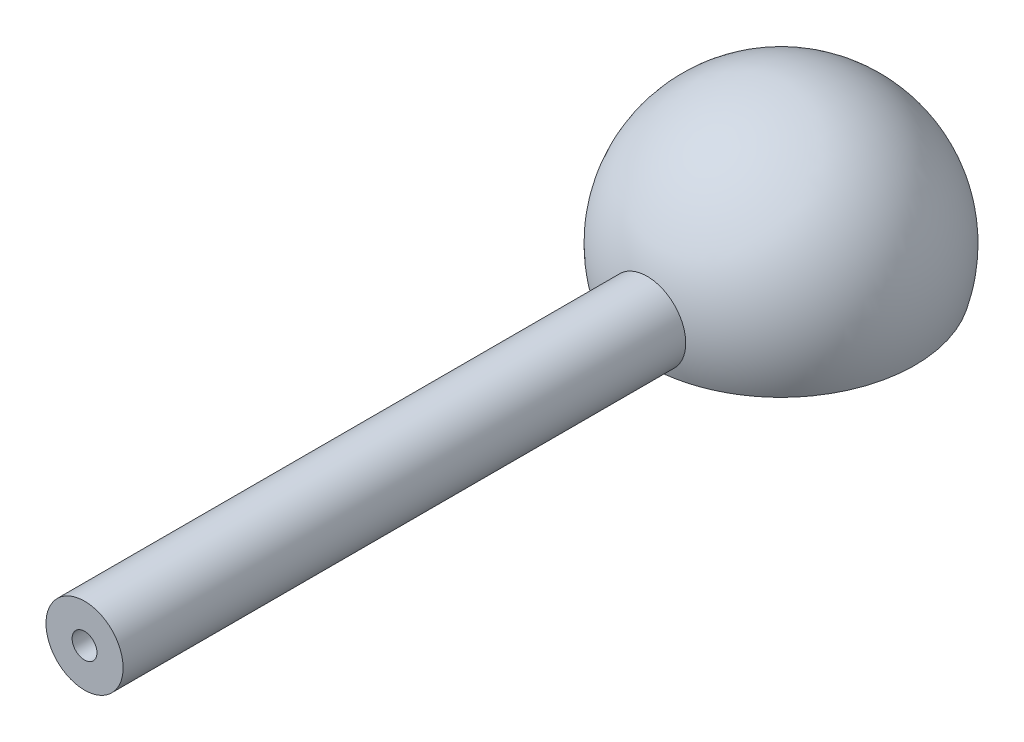
ISO-10303-21;
HEADER;
FILE_DESCRIPTION(('STEP AP214'),'2;1');
FILE_NAME('part.step','',(''),(''),'','','');
FILE_SCHEMA(('AUTOMOTIVE_DESIGN { 1 0 10303 214 1 1 1 1 }'));
ENDSEC;
DATA;
#1=APPLICATION_CONTEXT('core data for automotive mechanical design processes');
#2=APPLICATION_PROTOCOL_DEFINITION('international standard','automotive_design',2000,#1);
#3=PRODUCT_CONTEXT('',#1,'mechanical');
#4=PRODUCT('Part','Part','',(#3));
#5=PRODUCT_RELATED_PRODUCT_CATEGORY('part','',(#4));
#6=PRODUCT_DEFINITION_FORMATION('','',#4);
#7=PRODUCT_DEFINITION_CONTEXT('part definition',#1,'design');
#8=PRODUCT_DEFINITION('design','',#6,#7);
#9=PRODUCT_DEFINITION_SHAPE('','',#8);
#10=(LENGTH_UNIT() NAMED_UNIT(*) SI_UNIT(.MILLI.,.METRE.));
#11=(NAMED_UNIT(*) PLANE_ANGLE_UNIT() SI_UNIT($,.RADIAN.));
#12=(NAMED_UNIT(*) SI_UNIT($,.STERADIAN.) SOLID_ANGLE_UNIT());
#13=UNCERTAINTY_MEASURE_WITH_UNIT(LENGTH_MEASURE(1.E-05),#10,'distance_accuracy_value','');
#14=(GEOMETRIC_REPRESENTATION_CONTEXT(3) GLOBAL_UNCERTAINTY_ASSIGNED_CONTEXT((#13)) GLOBAL_UNIT_ASSIGNED_CONTEXT((#10,
#11,#12)) REPRESENTATION_CONTEXT('',''));
#15=CARTESIAN_POINT('',(0.,0.,0.));
#16=DIRECTION('',(0.,0.,1.));
#17=DIRECTION('',(1.,0.,0.));
#18=AXIS2_PLACEMENT_3D('',#15,#16,#17);
#19=CARTESIAN_POINT('',(0.,0.,130.));
#20=DIRECTION('',(0.,0.,-1.));
#21=DIRECTION('',(-1.,0.,0.));
#22=AXIS2_PLACEMENT_3D('',#19,#20,#21);
#23=CYLINDRICAL_SURFACE('',#22,9.);
#24=CARTESIAN_POINT('',(0.,0.,-1.27100706074562));
#25=DIRECTION('',(0.,0.,-1.));
#26=DIRECTION('',(-1.,0.,0.));
#27=AXIS2_PLACEMENT_3D('',#24,#25,#26);
#28=CIRCLE('',#27,8.99999999999998);
#29=CARTESIAN_POINT('',(0.,-9.,-1.27100706074562));
#30=VERTEX_POINT('',#29);
#31=EDGE_CURVE('E91',#30,#30,#28,.T.);
#32=ORIENTED_EDGE('',*,*,#31,.F.);
#33=EDGE_LOOP('',(#32));
#34=FACE_BOUND('',#33,.T.);
#35=CARTESIAN_POINT('',(0.,0.,130.));
#36=DIRECTION('',(0.,0.,1.));
#37=DIRECTION('',(1.,0.,0.));
#38=AXIS2_PLACEMENT_3D('',#35,#36,#37);
#39=CIRCLE('',#38,9.);
#40=CARTESIAN_POINT('',(9.,0.,130.));
#41=VERTEX_POINT('',#40);
#42=EDGE_CURVE('E11',#41,#41,#39,.T.);
#43=ORIENTED_EDGE('',*,*,#42,.F.);
#44=EDGE_LOOP('',(#43));
#45=FACE_BOUND('',#44,.T.);
#46=ADVANCED_FACE('F44',(#34,#45),#23,.T.);
#47=CARTESIAN_POINT('',(0.,0.,130.));
#48=DIRECTION('',(0.,0.,1.));
#49=DIRECTION('',(1.,0.,0.));
#50=AXIS2_PLACEMENT_3D('',#47,#48,#49);
#51=PLANE('',#50);
#52=CARTESIAN_POINT('',(0.,0.,130.));
#53=DIRECTION('',(0.,0.,1.));
#54=DIRECTION('',(1.,0.,0.));
#55=AXIS2_PLACEMENT_3D('',#52,#53,#54);
#56=CIRCLE('',#55,2.9);
#57=CARTESIAN_POINT('',(2.9,0.,130.));
#58=VERTEX_POINT('',#57);
#59=EDGE_CURVE('E95',#58,#58,#56,.T.);
#60=ORIENTED_EDGE('',*,*,#59,.F.);
#61=EDGE_LOOP('',(#60));
#62=FACE_BOUND('',#61,.T.);
#63=ORIENTED_EDGE('',*,*,#42,.T.);
#64=EDGE_LOOP('',(#63));
#65=FACE_BOUND('',#64,.T.);
#66=ADVANCED_FACE('F82',(#62,#65),#51,.T.);
#67=CARTESIAN_POINT('',(0.,0.,20.));
#68=DIRECTION('',(0.,0.,1.));
#69=DIRECTION('',(1.,0.,0.));
#70=AXIS2_PLACEMENT_3D('',#67,#68,#69);
#71=CYLINDRICAL_SURFACE('',#70,2.9);
#72=CARTESIAN_POINT('',(0.,0.,20.));
#73=DIRECTION('',(0.,0.,1.));
#74=DIRECTION('',(1.,0.,0.));
#75=AXIS2_PLACEMENT_3D('',#72,#73,#74);
#76=CIRCLE('',#75,2.9);
#77=CARTESIAN_POINT('',(2.9,0.,20.));
#78=VERTEX_POINT('',#77);
#79=EDGE_CURVE('E53',#78,#78,#76,.T.);
#80=ORIENTED_EDGE('',*,*,#79,.F.);
#81=EDGE_LOOP('',(#80));
#82=FACE_BOUND('',#81,.T.);
#83=ORIENTED_EDGE('',*,*,#59,.T.);
#84=EDGE_LOOP('',(#83));
#85=FACE_BOUND('',#84,.T.);
#86=ADVANCED_FACE('F75',(#82,#85),#71,.F.);
#87=CARTESIAN_POINT('',(0.,0.,20.));
#88=DIRECTION('',(0.,0.,1.));
#89=DIRECTION('',(1.,0.,0.));
#90=AXIS2_PLACEMENT_3D('',#87,#88,#89);
#91=PLANE('',#90);
#92=ORIENTED_EDGE('',*,*,#79,.T.);
#93=EDGE_LOOP('',(#92));
#94=FACE_BOUND('',#93,.T.);
#95=ADVANCED_FACE('F65',(#94),#91,.T.);
#96=CARTESIAN_POINT('',(0.,0.,-32.5));
#97=DIRECTION('',(0.,1.,0.));
#98=DIRECTION('',(1.,0.,0.));
#99=AXIS2_PLACEMENT_3D('',#96,#97,#98);
#100=ELLIPSE('',#99,32.5,32.5);
#101=TRIMMED_CURVE('',#100,(PARAMETER_VALUE(1.5707963267949)),
(PARAMETER_VALUE(4.71238898038469)),.T.,.PARAMETER.);
#102=CARTESIAN_POINT('',(0.,0.,-65.));
#103=DIRECTION('',(0.,0.,-1.));
#104=AXIS1_PLACEMENT('',#102,#103);
#105=SURFACE_OF_REVOLUTION('',#101,#104);
#106=ORIENTED_EDGE('',*,*,#31,.T.);
#107=CARTESIAN_POINT('',(0.,-9.00000000000001,-1.27100706074561));
#108=CARTESIAN_POINT('',(-1.09121169100416,-9.00000000000001,-1.27101462029589));
#109=CARTESIAN_POINT('',(-2.18257813141674,-9.,-1.32825904998093));
#110=CARTESIAN_POINT('',(-4.3533184452436,-9.,-1.5566698646595));
#111=CARTESIAN_POINT('',(-5.43269238798555,-9.,-1.72783559073434));
#112=CARTESIAN_POINT('',(-7.35816859991174,-9.,-2.13756367035628));
#113=CARTESIAN_POINT('',(-8.2085363619717,-9.,-2.35634749586137));
#114=CARTESIAN_POINT('',(-9.8881124381179,-9.,-2.86479920158872));
#115=CARTESIAN_POINT('',(-10.7173150880257,-9.,-3.15448584157706));
#116=CARTESIAN_POINT('',(-12.3492805331064,-9.,-3.80301104589659));
#117=CARTESIAN_POINT('',(-13.1520127658921,-9.,-4.16192647812892));
#118=CARTESIAN_POINT('',(-14.7243159955969,-9.,-4.94612155391398));
#119=CARTESIAN_POINT('',(-15.4938892060885,-9.00000000000001,-5.37139675875008));
#120=CARTESIAN_POINT('',(-16.9941065072693,-9.00000000000001,-6.28509253299466));
#121=CARTESIAN_POINT('',(-17.7247682027288,-9.,-6.77348419789206));
#122=CARTESIAN_POINT('',(-19.142357309746,-9.,-7.81009926493778));
#123=CARTESIAN_POINT('',(-19.829284025757,-9.,-8.3583236182692));
#124=CARTESIAN_POINT('',(-21.1543346851692,-9.,-9.51055081265856));
#125=CARTESIAN_POINT('',(-21.7924711204248,-9.,-10.1145392883218));
#126=CARTESIAN_POINT('',(-23.0155987108718,-9.,-11.374118765068));
#127=CARTESIAN_POINT('',(-23.6005900754352,-9.,-12.0297095628378));
#128=CARTESIAN_POINT('',(-24.7133320437638,-9.,-13.3879088833848));
#129=CARTESIAN_POINT('',(-25.2410765092781,-9.,-14.0905224351029));
#130=CARTESIAN_POINT('',(-26.2355014563035,-9.,-15.5377102786163));
#131=CARTESIAN_POINT('',(-26.7021818754775,-9.,-16.282284613246));
#132=CARTESIAN_POINT('',(-27.5711774932994,-9.,-17.808130096285));
#133=CARTESIAN_POINT('',(-27.9734901651407,-9.,-18.5894026837564));
#134=CARTESIAN_POINT('',(-28.7108677650759,-9.,-20.1830628144949));
#135=CARTESIAN_POINT('',(-29.0459327064345,-9.00000000000001,-20.9954503516247));
#136=CARTESIAN_POINT('',(-29.6464271217268,-9.00000000000001,-22.6455492550538));
#137=CARTESIAN_POINT('',(-29.9118578991476,-9.,-23.4832601469962));
#138=CARTESIAN_POINT('',(-30.3712051681035,-9.,-25.1780646548374));
#139=CARTESIAN_POINT('',(-30.5651216583103,-9.,-26.0351582710962));
#140=CARTESIAN_POINT('',(-30.8800613888084,-9.,-27.7626330044566));
#141=CARTESIAN_POINT('',(-31.0010847782125,-9.00000000000001,-28.6330140943731));
#142=CARTESIAN_POINT('',(-31.1693785264939,-9.,-30.3808776139644));
#143=CARTESIAN_POINT('',(-31.2166488854577,-8.99999999999999,-31.2583600436308));
#144=CARTESIAN_POINT('',(-31.2371005291583,-8.99999999999999,-33.0141895756849));
#145=CARTESIAN_POINT('',(-31.2102816710662,-9.,-33.8925366797362));
#146=CARTESIAN_POINT('',(-31.0827452413462,-9.00000000000001,-35.6438493367776));
#147=CARTESIAN_POINT('',(-30.982027669739,-9.,-36.5168148897691));
#148=CARTESIAN_POINT('',(-30.7074101058874,-9.,-38.2511565949928));
#149=CARTESIAN_POINT('',(-30.5335102465747,-9.,-39.1125327682735));
#150=CARTESIAN_POINT('',(-30.1137644454871,-9.,-40.8175734747158));
#151=CARTESIAN_POINT('',(-29.8679185038001,-9.00000000000001,-41.6612380078991));
#152=CARTESIAN_POINT('',(-29.3060282462703,-9.00000000000001,-43.3248578094392));
#153=CARTESIAN_POINT('',(-28.9899839040377,-9.,-44.1448130688827));
#154=CARTESIAN_POINT('',(-28.2899437815519,-9.,-45.7551846085263));
#155=CARTESIAN_POINT('',(-27.9059480012081,-9.,-46.545600888687));
#156=CARTESIAN_POINT('',(-27.0727345357553,-9.,-48.0912759120119));
#157=CARTESIAN_POINT('',(-26.6235167812314,-9.,-48.8465346177572));
#158=CARTESIAN_POINT('',(-25.6630533446053,-9.,-50.3165241515818));
#159=CARTESIAN_POINT('',(-25.1518076624712,-9.00000000000001,-51.0312549796403));
#160=CARTESIAN_POINT('',(-24.0709232027363,-9.00000000000001,-52.4151072172093));
#161=CARTESIAN_POINT('',(-23.501284444302,-9.,-53.0842286416902));
#162=CARTESIAN_POINT('',(-22.3076634850059,-9.,-54.3721052745974));
#163=CARTESIAN_POINT('',(-21.6836812841842,-9.,-54.990860483061));
#164=CARTESIAN_POINT('',(-20.3858098464218,-9.,-56.1736054622076));
#165=CARTESIAN_POINT('',(-19.7119206298492,-9.,-56.7375952552411));
#166=CARTESIAN_POINT('',(-18.3190258828803,-9.,-57.8068000619616));
#167=CARTESIAN_POINT('',(-17.6000203524893,-9.,-58.3120150756554));
#168=CARTESIAN_POINT('',(-16.1220045720644,-9.,-59.2600786147026));
#169=CARTESIAN_POINT('',(-15.3629943165014,-9.,-59.7029271314361));
#170=CARTESIAN_POINT('',(-13.8103652841963,-9.,-60.5231092065968));
#171=CARTESIAN_POINT('',(-13.0167465074455,-9.,-60.9004427650076));
#172=CARTESIAN_POINT('',(-11.4005424795197,-9.,-61.5869123535489));
#173=CARTESIAN_POINT('',(-10.5779572245259,-9.,-61.8960483746887));
#174=CARTESIAN_POINT('',(-8.90966842818976,-9.,-62.4439250531867));
#175=CARTESIAN_POINT('',(-8.06396488684652,-9.00000000000001,-62.6826657105424));
#176=CARTESIAN_POINT('',(-6.35545200095075,-9.00000000000001,-63.0880543494989));
#177=CARTESIAN_POINT('',(-5.4926426571354,-9.,-63.2547023342064));
#178=CARTESIAN_POINT('',(-3.75605218873982,-9.,-63.5147208754143));
#179=CARTESIAN_POINT('',(-2.88227106416046,-9.,-63.6080914319204));
#180=CARTESIAN_POINT('',(-1.12994913482816,-9.,-63.7208913054453));
#181=CARTESIAN_POINT('',(-0.251408330292715,-9.,-63.7403206258427));
#182=CARTESIAN_POINT('',(1.50418710011557,-9.,-63.7050999056521));
#183=CARTESIAN_POINT('',(2.38124172598846,-9.00000000000001,-63.6504498650661));
#184=CARTESIAN_POINT('',(4.12762946615012,-9.00000000000001,-63.4674589519904));
#185=CARTESIAN_POINT('',(4.99696258044166,-9.,-63.3391180795268));
#186=CARTESIAN_POINT('',(6.72172686046704,-9.,-63.0096579293626));
#187=CARTESIAN_POINT('',(7.57715802620049,-9.,-62.8085386516599));
#188=CARTESIAN_POINT('',(9.26803684559245,-9.,-62.3349515175289));
#189=CARTESIAN_POINT('',(10.1034844983236,-9.,-62.0624836577896));
#190=CARTESIAN_POINT('',(11.7484567180875,-9.,-61.4481364472466));
#191=CARTESIAN_POINT('',(12.5579812851181,-9.,-61.1062570964372));
#192=CARTESIAN_POINT('',(14.1453521337152,-9.,-60.3555174445974));
#193=CARTESIAN_POINT('',(14.923198413878,-9.,-59.9466571405991));
#194=CARTESIAN_POINT('',(16.44168262895,-9.,-59.0648623452531));
#195=CARTESIAN_POINT('',(17.1823205638605,-9.,-58.5919278539077));
#196=CARTESIAN_POINT('',(18.6211224985784,-9.,-57.5853470332402));
#197=CARTESIAN_POINT('',(19.3192865041185,-9.,-57.0517007121127));
#198=CARTESIAN_POINT('',(20.6681771615171,-9.,-55.9274900854697));
#199=CARTESIAN_POINT('',(21.3189038133879,-9.,-55.3369257799691));
#200=CARTESIAN_POINT('',(22.5682933993967,-9.,-54.103077829461));
#201=CARTESIAN_POINT('',(23.1669563408816,-9.,-53.4597941918931));
#202=CARTESIAN_POINT('',(24.3079624760348,-9.,-52.1250808643214));
#203=CARTESIAN_POINT('',(24.8503056696963,-9.,-51.4336511743117));
#204=CARTESIAN_POINT('',(25.874816789428,-9.,-50.0075610929392));
#205=CARTESIAN_POINT('',(26.356984690402,-9.,-49.272900683547));
#206=CARTESIAN_POINT('',(27.2577170345953,-9.,-47.7655724220946));
#207=CARTESIAN_POINT('',(27.676281477767,-9.,-46.992904570006));
#208=CARTESIAN_POINT('',(28.4468312907642,-9.,-45.4150543684254));
#209=CARTESIAN_POINT('',(28.7988166384216,-9.,-44.6098720081075));
#210=CARTESIAN_POINT('',(29.4337056797823,-9.,-42.9727174019057));
#211=CARTESIAN_POINT('',(29.7166093735219,-9.,-42.1407451560358));
#212=CARTESIAN_POINT('',(30.21132356138,-9.,-40.4559265221511));
#213=CARTESIAN_POINT('',(30.42313413247,-9.,-39.6030801567374));
#214=CARTESIAN_POINT('',(30.7741566523536,-9.,-37.8825756369759));
#215=CARTESIAN_POINT('',(30.9133686012451,-9.,-37.0149174826479));
#216=CARTESIAN_POINT('',(31.118204126752,-9.,-35.270958229386));
#217=CARTESIAN_POINT('',(31.1838277305354,-9.,-34.3946571336431));
#218=CARTESIAN_POINT('',(31.2410201145267,-9.,-32.639641645347));
#219=CARTESIAN_POINT('',(31.2325888946434,-9.,-31.760927252791));
#220=CARTESIAN_POINT('',(31.1417314888779,-9.,-30.0073306947185));
#221=CARTESIAN_POINT('',(31.059305168228,-9.,-29.1324485361847));
#222=CARTESIAN_POINT('',(30.8210433766428,-9.,-27.3927379575103));
#223=CARTESIAN_POINT('',(30.665207905678,-9.00000000000001,-26.5279095373737));
#224=CARTESIAN_POINT('',(30.2812361046889,-9.00000000000001,-24.8144566085794));
#225=CARTESIAN_POINT('',(30.0530999221978,-9.,-23.9658320668605));
#226=CARTESIAN_POINT('',(29.5261485096089,-9.,-22.2908182777976));
#227=CARTESIAN_POINT('',(29.2273332795151,-9.,-21.4644290304523));
#228=CARTESIAN_POINT('',(28.5611474079179,-9.,-19.8397591067272));
#229=CARTESIAN_POINT('',(28.193776611157,-9.,-19.0414784940098));
#230=CARTESIAN_POINT('',(27.3930918507298,-9.,-17.4787031322321));
#231=CARTESIAN_POINT('',(26.9597778878663,-9.00000000000001,-16.7142083827606));
#232=CARTESIAN_POINT('',(26.030278358642,-9.00000000000001,-15.224425357023));
#233=CARTESIAN_POINT('',(25.534091570583,-9.,-14.4991378429936));
#234=CARTESIAN_POINT('',(24.4823806242607,-9.,-13.0929417499085));
#235=CARTESIAN_POINT('',(23.9268564557823,-9.,-12.4120331784927));
#236=CARTESIAN_POINT('',(22.7604443240045,-9.,-11.0994630415563));
#237=CARTESIAN_POINT('',(22.1495586267526,-9.,-10.467799462316));
#238=CARTESIAN_POINT('',(20.8767475053885,-9.,-9.25817950326863));
#239=CARTESIAN_POINT('',(20.2148221281326,-9.,-8.68022307415753));
#240=CARTESIAN_POINT('',(18.8447124999005,-9.,-7.58218614982155));
#241=CARTESIAN_POINT('',(18.1365333602952,-9.,-7.06209927671293));
#242=CARTESIAN_POINT('',(16.6788817721266,-9.,-6.08342291125685));
#243=CARTESIAN_POINT('',(15.9294091789835,-9.,-5.62483363424864));
#244=CARTESIAN_POINT('',(14.3942961586391,-9.,-4.7723011053097));
#245=CARTESIAN_POINT('',(13.6086462104194,-9.,-4.37837499714187));
#246=CARTESIAN_POINT('',(12.0069624196472,-9.,-3.65812270083005));
#247=CARTESIAN_POINT('',(11.1909290070078,-9.,-3.33179555661792));
#248=CARTESIAN_POINT('',(9.53175747879597,-9.,-2.74817158691787));
#249=CARTESIAN_POINT('',(8.68854476065241,-9.,-2.49108681431057));
#250=CARTESIAN_POINT('',(6.9833551633399,-9.,-2.04907897503269));
#251=CARTESIAN_POINT('',(6.12137698637557,-9.,-1.86416091616618));
#252=CARTESIAN_POINT('',(4.38583227802104,-9.,-1.56800206970643));
#253=CARTESIAN_POINT('',(3.51227976033253,-9.,-1.45667924769263));
#254=CARTESIAN_POINT('',(1.75918390312392,-9.,-1.30818862577003));
#255=CARTESIAN_POINT('',(0.879642231313656,-9.00000000000001,-1.27100096687792));
#256=CARTESIAN_POINT('',(0.,-9.00000000000001,-1.27100706074561));
#257=B_SPLINE_CURVE_WITH_KNOTS('',3,(#107,#108,#109,#110,#111,#112,#113,#114,#115,#116,#117,
#118,#119,#120,#121,#122,#123,#124,#125,#126,#127,#128,#129,#130,#131,#132,#133,#134,#135,#136,
#137,#138,#139,#140,#141,#142,#143,#144,#145,#146,#147,#148,#149,#150,#151,#152,#153,#154,#155,
#156,#157,#158,#159,#160,#161,#162,#163,#164,#165,#166,#167,#168,#169,#170,#171,#172,#173,#174,
#175,#176,#177,#178,#179,#180,#181,#182,#183,#184,#185,#186,#187,#188,#189,#190,#191,#192,#193,
#194,#195,#196,#197,#198,#199,#200,#201,#202,#203,#204,#205,#206,#207,#208,#209,#210,#211,#212,
#213,#214,#215,#216,#217,#218,#219,#220,#221,#222,#223,#224,#225,#226,#227,#228,#229,#230,#231,
#232,#233,#234,#235,#236,#237,#238,#239,#240,#241,#242,#243,#244,#245,#246,#247,#248,#249,#250,
#251,#252,#253,#254,#255,#256),.UNSPECIFIED.,.T.,.F.,(4,2,2,2,2,2,2,2,2,2,2,2,2,2,2,2,2,2,2,2,2,
2,2,2,2,2,2,2,2,2,2,2,2,2,2,2,2,2,2,2,2,2,2,2,2,2,2,2,2,2,2,2,2,2,2,2,2,2,2,2,2,2,2,2,2,2,2,2,2,
2,2,2,2,2,4),(0.,3.27244622302445,6.54487351844482,9.17606842309235,11.807960254399,
14.4427913956208,17.0774463719923,19.7108990418891,22.3443935828888,24.9772115923063,
27.6100192289397,30.2431088877109,32.8762012344424,35.5093969199353,38.1425920860313,
40.7757379576384,43.4088838781485,46.0420244121803,48.6751649431265,51.3083105502327,
53.9414561566003,56.5745969800221,59.2077378002217,61.8408796103022,64.4740214238929,
67.1071660399249,69.7403106573169,72.3734544104382,75.0065981616197,77.6397408381703,
80.2728835144121,82.9060265545949,85.5391695954429,88.1723129834284,90.8054563715074,
93.4385996461113,96.0717429205078,98.7048860745916,101.338029228603,103.971172381674,
106.604315534817,109.237458810151,111.870602085698,114.503745477916,117.136888870039,
119.770031906756,122.403174942793,125.036317607257,127.669460272041,130.302604034978,
132.935747799888,135.568892441526,138.202037081779,140.835178871158,143.468320656983,
146.10146147068,148.73460228762,151.36774790032,154.000893514079,156.634033754806,
159.267173995388,161.900320199308,164.533466371174,167.166663716234,169.799861514602,
172.432951580054,175.066039228265,177.698836392207,180.331642774879,182.965146054443,
185.598612085203,188.240053625288,190.881678428127,193.520353703242,196.158322047245),.UNSPECIFIED.);
#258=EDGE_CURVE('E59',#30,#30,#257,.T.);
#259=ORIENTED_EDGE('',*,*,#258,.F.);
#260=EDGE_LOOP('',(#106,#259));
#261=FACE_BOUND('',#260,.T.);
#262=CARTESIAN_POINT('',(0.,0.,-65.));
#263=VERTEX_POINT('',#262);
#264=VERTEX_LOOP('',#263);
#265=FACE_BOUND('',#264,.T.);
#266=ADVANCED_FACE('F62',(#261,#265),#105,.F.);
#267=CARTESIAN_POINT('',(50.,-9.,0.235218720654392));
#268=DIRECTION('',(0.,1.,0.));
#269=DIRECTION('',(0.,0.,1.));
#270=AXIS2_PLACEMENT_3D('',#267,#268,#269);
#271=PLANE('',#270);
#272=ORIENTED_EDGE('',*,*,#258,.T.);
#273=EDGE_LOOP('',(#272));
#274=FACE_BOUND('',#273,.T.);
#275=CARTESIAN_POINT('',(0.,-9.,-32.6201692239184));
#276=DIRECTION('',(0.,1.,0.));
#277=DIRECTION('',(0.,0.,1.));
#278=AXIS2_PLACEMENT_3D('',#275,#276,#277);
#279=CIRCLE('',#278,30.);
#280=CARTESIAN_POINT('',(0.,-9.,-2.62016922391838));
#281=VERTEX_POINT('',#280);
#282=EDGE_CURVE('E47',#281,#281,#279,.F.);
#283=ORIENTED_EDGE('',*,*,#282,.F.);
#284=EDGE_LOOP('',(#283));
#285=FACE_BOUND('',#284,.T.);
#286=ADVANCED_FACE('F64',(#274,#285),#271,.F.);
#287=CARTESIAN_POINT('',(0.378974550513894,0.,-32.7609216958857));
#288=DIRECTION('',(0.,0.,-1.));
#289=DIRECTION('',(1.,0.,0.));
#290=AXIS2_PLACEMENT_3D('',#287,#288,#289);
#291=SPHERICAL_SURFACE('',#290,27.5);
#292=CARTESIAN_POINT('',(0.378974550513894,0.,-32.7609216958857));
#293=DIRECTION('',(0.,1.,0.));
#294=DIRECTION('',(0.,0.,1.));
#295=AXIS2_PLACEMENT_3D('',#292,#293,#294);
#296=SPHERICAL_SURFACE('',#295,27.5);
#297=CARTESIAN_POINT('',(0.378974550513894,0.,-32.7609216958857));
#298=DIRECTION('',(0.,1.,0.));
#299=DIRECTION('',(0.,0.,1.));
#300=AXIS2_PLACEMENT_3D('',#297,#298,#299);
#301=CIRCLE('',#300,27.5);
#302=CARTESIAN_POINT('',(0.378974550513894,0.,-5.26092169588568));
#303=VERTEX_POINT('',#302);
#304=EDGE_CURVE('E96',#303,#303,#301,.F.);
#305=ORIENTED_EDGE('',*,*,#304,.T.);
#306=EDGE_LOOP('',(#305));
#307=FACE_BOUND('',#306,.T.);
#308=ADVANCED_FACE('F72',(#307),#296,.F.);
#309=CARTESIAN_POINT('',(0.,0.,-32.6201692239184));
#310=DIRECTION('',(0.,1.,0.));
#311=DIRECTION('',(0.,0.,1.));
#312=AXIS2_PLACEMENT_3D('',#309,#310,#311);
#313=PLANE('',#312);
#314=CARTESIAN_POINT('',(0.,0.,-32.6201692239184));
#315=DIRECTION('',(0.,1.,0.));
#316=DIRECTION('',(0.,0.,1.));
#317=AXIS2_PLACEMENT_3D('',#314,#315,#316);
#318=CIRCLE('',#317,30.);
#319=CARTESIAN_POINT('',(0.,0.,-2.62016922391838));
#320=VERTEX_POINT('',#319);
#321=EDGE_CURVE('E103',#320,#320,#318,.T.);
#322=ORIENTED_EDGE('',*,*,#321,.F.);
#323=EDGE_LOOP('',(#322));
#324=FACE_BOUND('',#323,.T.);
#325=ORIENTED_EDGE('',*,*,#304,.F.);
#326=EDGE_LOOP('',(#325));
#327=FACE_BOUND('',#326,.T.);
#328=ADVANCED_FACE('F128',(#324,#327),#313,.F.);
#329=CARTESIAN_POINT('',(0.,-50.,-32.6201692239184));
#330=DIRECTION('',(0.,1.,0.));
#331=DIRECTION('',(0.,0.,1.));
#332=AXIS2_PLACEMENT_3D('',#329,#330,#331);
#333=CYLINDRICAL_SURFACE('',#332,30.);
#334=ORIENTED_EDGE('',*,*,#282,.T.);
#335=EDGE_LOOP('',(#334));
#336=FACE_BOUND('',#335,.T.);
#337=ORIENTED_EDGE('',*,*,#321,.T.);
#338=EDGE_LOOP('',(#337));
#339=FACE_BOUND('',#338,.T.);
#340=ADVANCED_FACE('F131',(#336,#339),#333,.F.);
#341=CLOSED_SHELL('',(#46,#66,#86,#95,#266,#286,#308,#328,#340));
#342=MANIFOLD_SOLID_BREP('B2',#341);
#343=ADVANCED_BREP_SHAPE_REPRESENTATION('',(#18,#342),#14);
#344=SHAPE_DEFINITION_REPRESENTATION(#9,#343);
ENDSEC;
END-ISO-10303-21;
